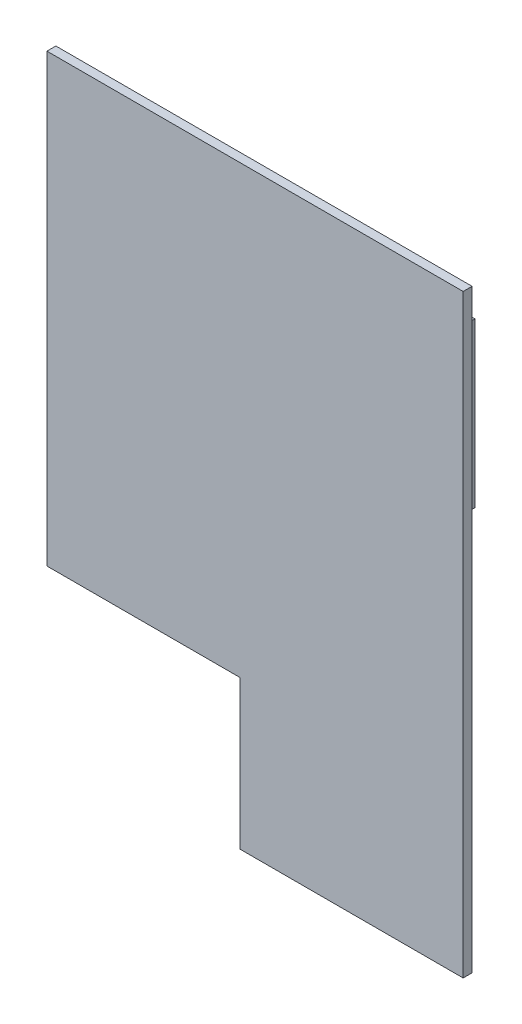
ISO-10303-21;
HEADER;
FILE_DESCRIPTION(('STEP AP214'),'2;1');
FILE_NAME('part.step','',(''),(''),'','','');
FILE_SCHEMA(('AUTOMOTIVE_DESIGN { 1 0 10303 214 1 1 1 1 }'));
ENDSEC;
DATA;
#1=APPLICATION_CONTEXT('core data for automotive mechanical design processes');
#2=APPLICATION_PROTOCOL_DEFINITION('international standard','automotive_design',2000,#1);
#3=PRODUCT_CONTEXT('',#1,'mechanical');
#4=PRODUCT('Part','Part','',(#3));
#5=PRODUCT_RELATED_PRODUCT_CATEGORY('part','',(#4));
#6=PRODUCT_DEFINITION_FORMATION('','',#4);
#7=PRODUCT_DEFINITION_CONTEXT('part definition',#1,'design');
#8=PRODUCT_DEFINITION('design','',#6,#7);
#9=PRODUCT_DEFINITION_SHAPE('','',#8);
#10=(LENGTH_UNIT() NAMED_UNIT(*) SI_UNIT(.MILLI.,.METRE.));
#11=(NAMED_UNIT(*) PLANE_ANGLE_UNIT() SI_UNIT($,.RADIAN.));
#12=(NAMED_UNIT(*) SI_UNIT($,.STERADIAN.) SOLID_ANGLE_UNIT());
#13=UNCERTAINTY_MEASURE_WITH_UNIT(LENGTH_MEASURE(1.E-05),#10,'distance_accuracy_value','');
#14=(GEOMETRIC_REPRESENTATION_CONTEXT(3) GLOBAL_UNCERTAINTY_ASSIGNED_CONTEXT((#13)) GLOBAL_UNIT_ASSIGNED_CONTEXT((#10,
#11,#12)) REPRESENTATION_CONTEXT('',''));
#15=CARTESIAN_POINT('',(0.,0.,0.));
#16=DIRECTION('',(0.,0.,1.));
#17=DIRECTION('',(1.,0.,0.));
#18=AXIS2_PLACEMENT_3D('',#15,#16,#17);
#19=CARTESIAN_POINT('',(0.,0.,-3.));
#20=DIRECTION('',(0.,0.,-1.));
#21=DIRECTION('',(1.,0.,0.));
#22=AXIS2_PLACEMENT_3D('',#19,#20,#21);
#23=PLANE('',#22);
#24=DIRECTION('',(1.,0.,0.));
#25=VECTOR('',#24,1.);
#26=CARTESIAN_POINT('',(0.,-200.,-3.));
#27=LINE('',#26,#25);
#28=CARTESIAN_POINT('',(65.,-200.,-3.));
#29=VERTEX_POINT('',#28);
#30=CARTESIAN_POINT('',(140.,-200.,-3.));
#31=VERTEX_POINT('',#30);
#32=EDGE_CURVE('E246',#29,#31,#27,.T.);
#33=ORIENTED_EDGE('',*,*,#32,.F.);
#34=DIRECTION('',(0.,1.,0.));
#35=VECTOR('',#34,1.);
#36=CARTESIAN_POINT('',(65.,0.,-3.));
#37=LINE('',#36,#35);
#38=CARTESIAN_POINT('',(65.,-150.,-3.));
#39=VERTEX_POINT('',#38);
#40=EDGE_CURVE('E234',#29,#39,#37,.T.);
#41=ORIENTED_EDGE('',*,*,#40,.T.);
#42=DIRECTION('',(-1.,0.,0.));
#43=VECTOR('',#42,1.);
#44=CARTESIAN_POINT('',(0.,-150.,-3.));
#45=LINE('',#44,#43);
#46=CARTESIAN_POINT('',(0.,-150.,-3.));
#47=VERTEX_POINT('',#46);
#48=EDGE_CURVE('E231',#39,#47,#45,.T.);
#49=ORIENTED_EDGE('',*,*,#48,.T.);
#50=DIRECTION('',(0.,-1.,0.));
#51=VECTOR('',#50,1.);
#52=CARTESIAN_POINT('',(0.,0.,-3.));
#53=LINE('',#52,#51);
#54=CARTESIAN_POINT('',(0.,0.,-3.));
#55=VERTEX_POINT('',#54);
#56=EDGE_CURVE('E237',#55,#47,#53,.T.);
#57=ORIENTED_EDGE('',*,*,#56,.F.);
#58=DIRECTION('',(-1.,0.,0.));
#59=VECTOR('',#58,1.);
#60=CARTESIAN_POINT('',(0.,0.,-3.));
#61=LINE('',#60,#59);
#62=CARTESIAN_POINT('',(140.,0.,-3.));
#63=VERTEX_POINT('',#62);
#64=EDGE_CURVE('E240',#63,#55,#61,.T.);
#65=ORIENTED_EDGE('',*,*,#64,.F.);
#66=DIRECTION('',(0.,1.,0.));
#67=VECTOR('',#66,1.);
#68=CARTESIAN_POINT('',(140.,0.,-3.));
#69=LINE('',#68,#67);
#70=EDGE_CURVE('E243',#31,#63,#69,.T.);
#71=ORIENTED_EDGE('',*,*,#70,.F.);
#72=EDGE_LOOP('',(#33,#41,#49,#57,#65,#71));
#73=FACE_BOUND('',#72,.T.);
#74=DIRECTION('',(0.,-1.,0.));
#75=VECTOR('',#74,1.);
#76=CARTESIAN_POINT('',(8.,0.,-3.));
#77=LINE('',#76,#75);
#78=CARTESIAN_POINT('',(8.,-27.,-3.));
#79=VERTEX_POINT('',#78);
#80=CARTESIAN_POINT('',(8.,-82.,-3.));
#81=VERTEX_POINT('',#80);
#82=EDGE_CURVE('E214',#79,#81,#77,.T.);
#83=ORIENTED_EDGE('',*,*,#82,.F.);
#84=DIRECTION('',(1.,0.,0.));
#85=VECTOR('',#84,1.);
#86=CARTESIAN_POINT('',(0.,-27.,-3.));
#87=LINE('',#86,#85);
#88=CARTESIAN_POINT('',(5.,-27.,-3.));
#89=VERTEX_POINT('',#88);
#90=EDGE_CURVE('E190',#89,#79,#87,.T.);
#91=ORIENTED_EDGE('',*,*,#90,.F.);
#92=DIRECTION('',(0.,-1.,0.));
#93=VECTOR('',#92,1.);
#94=CARTESIAN_POINT('',(5.,0.,-3.));
#95=LINE('',#94,#93);
#96=CARTESIAN_POINT('',(5.00000000000001,-82.,-3.));
#97=VERTEX_POINT('',#96);
#98=EDGE_CURVE('E203',#89,#97,#95,.T.);
#99=ORIENTED_EDGE('',*,*,#98,.T.);
#100=DIRECTION('',(1.,0.,0.));
#101=VECTOR('',#100,1.);
#102=CARTESIAN_POINT('',(0.,-82.,-3.));
#103=LINE('',#102,#101);
#104=EDGE_CURVE('E217',#97,#81,#103,.T.);
#105=ORIENTED_EDGE('',*,*,#104,.T.);
#106=EDGE_LOOP('',(#83,#91,#99,#105));
#107=FACE_BOUND('',#106,.T.);
#108=DIRECTION('',(0.,1.,0.));
#109=VECTOR('',#108,1.);
#110=CARTESIAN_POINT('',(120.,-27.,-3.));
#111=LINE('',#110,#109);
#112=CARTESIAN_POINT('',(120.,-82.,-3.));
#113=VERTEX_POINT('',#112);
#114=CARTESIAN_POINT('',(120.,-27.,-3.));
#115=VERTEX_POINT('',#114);
#116=EDGE_CURVE('E172',#113,#115,#111,.T.);
#117=ORIENTED_EDGE('',*,*,#116,.F.);
#118=DIRECTION('',(-1.,0.,0.));
#119=VECTOR('',#118,1.);
#120=CARTESIAN_POINT('',(123.,-82.,-3.));
#121=LINE('',#120,#119);
#122=CARTESIAN_POINT('',(123.,-82.,-3.));
#123=VERTEX_POINT('',#122);
#124=EDGE_CURVE('E166',#123,#113,#121,.T.);
#125=ORIENTED_EDGE('',*,*,#124,.F.);
#126=DIRECTION('',(0.,-1.,0.));
#127=VECTOR('',#126,1.);
#128=CARTESIAN_POINT('',(123.,-27.,-3.));
#129=LINE('',#128,#127);
#130=CARTESIAN_POINT('',(123.,-27.,-3.));
#131=VERTEX_POINT('',#130);
#132=EDGE_CURVE('E147',#131,#123,#129,.T.);
#133=ORIENTED_EDGE('',*,*,#132,.F.);
#134=DIRECTION('',(1.,0.,0.));
#135=VECTOR('',#134,1.);
#136=CARTESIAN_POINT('',(123.,-27.,-3.));
#137=LINE('',#136,#135);
#138=EDGE_CURVE('E56',#115,#131,#137,.T.);
#139=ORIENTED_EDGE('',*,*,#138,.F.);
#140=EDGE_LOOP('',(#117,#125,#133,#139));
#141=FACE_BOUND('',#140,.T.);
#142=ADVANCED_FACE('F39',(#73,#107,#141),#23,.T.);
#143=CARTESIAN_POINT('',(0.,0.,3.));
#144=DIRECTION('',(1.,0.,0.));
#145=DIRECTION('',(0.,1.,0.));
#146=AXIS2_PLACEMENT_3D('',#143,#144,#145);
#147=PLANE('',#146);
#148=DIRECTION('',(0.,0.,-1.));
#149=VECTOR('',#148,1.);
#150=CARTESIAN_POINT('',(0.,-150.,10.));
#151=LINE('',#150,#149);
#152=CARTESIAN_POINT('',(0.,-150.,0.));
#153=VERTEX_POINT('',#152);
#154=EDGE_CURVE('E253',#153,#47,#151,.T.);
#155=ORIENTED_EDGE('',*,*,#154,.F.);
#156=DIRECTION('',(0.,-1.,0.));
#157=VECTOR('',#156,1.);
#158=CARTESIAN_POINT('',(0.,0.,0.));
#159=LINE('',#158,#157);
#160=CARTESIAN_POINT('',(0.,0.,0.));
#161=VERTEX_POINT('',#160);
#162=EDGE_CURVE('E64',#161,#153,#159,.T.);
#163=ORIENTED_EDGE('',*,*,#162,.F.);
#164=DIRECTION('',(0.,0.,-1.));
#165=VECTOR('',#164,1.);
#166=CARTESIAN_POINT('',(0.,0.,3.));
#167=LINE('',#166,#165);
#168=EDGE_CURVE('E252',#161,#55,#167,.T.);
#169=ORIENTED_EDGE('',*,*,#168,.T.);
#170=ORIENTED_EDGE('',*,*,#56,.T.);
#171=EDGE_LOOP('',(#155,#163,#169,#170));
#172=FACE_BOUND('',#171,.T.);
#173=ADVANCED_FACE('F41',(#172),#147,.F.);
#174=CARTESIAN_POINT('',(0.,-200.,3.));
#175=DIRECTION('',(0.,1.,0.));
#176=DIRECTION('',(0.,0.,1.));
#177=AXIS2_PLACEMENT_3D('',#174,#175,#176);
#178=PLANE('',#177);
#179=DIRECTION('',(0.,0.,-1.));
#180=VECTOR('',#179,1.);
#181=CARTESIAN_POINT('',(140.,-200.,3.));
#182=LINE('',#181,#180);
#183=CARTESIAN_POINT('',(140.,-200.,0.));
#184=VERTEX_POINT('',#183);
#185=EDGE_CURVE('E11',#184,#31,#182,.T.);
#186=ORIENTED_EDGE('',*,*,#185,.F.);
#187=DIRECTION('',(1.,0.,0.));
#188=VECTOR('',#187,1.);
#189=CARTESIAN_POINT('',(-0.00100000000002876,-200.,0.));
#190=LINE('',#189,#188);
#191=CARTESIAN_POINT('',(65.,-200.,0.));
#192=VERTEX_POINT('',#191);
#193=EDGE_CURVE('E161',#192,#184,#190,.T.);
#194=ORIENTED_EDGE('',*,*,#193,.F.);
#195=DIRECTION('',(0.,0.,-1.));
#196=VECTOR('',#195,1.);
#197=CARTESIAN_POINT('',(65.,-200.,10.));
#198=LINE('',#197,#196);
#199=EDGE_CURVE('E249',#192,#29,#198,.T.);
#200=ORIENTED_EDGE('',*,*,#199,.T.);
#201=ORIENTED_EDGE('',*,*,#32,.T.);
#202=EDGE_LOOP('',(#186,#194,#200,#201));
#203=FACE_BOUND('',#202,.T.);
#204=ADVANCED_FACE('F300',(#203),#178,.F.);
#205=CARTESIAN_POINT('',(140.,0.,3.));
#206=DIRECTION('',(-1.,0.,0.));
#207=DIRECTION('',(0.,-1.,0.));
#208=AXIS2_PLACEMENT_3D('',#205,#206,#207);
#209=PLANE('',#208);
#210=DIRECTION('',(0.,0.,-1.));
#211=VECTOR('',#210,1.);
#212=CARTESIAN_POINT('',(140.,0.,3.));
#213=LINE('',#212,#211);
#214=CARTESIAN_POINT('',(140.,0.,0.));
#215=VERTEX_POINT('',#214);
#216=EDGE_CURVE('E48',#215,#63,#213,.T.);
#217=ORIENTED_EDGE('',*,*,#216,.F.);
#218=DIRECTION('',(0.,1.,0.));
#219=VECTOR('',#218,1.);
#220=CARTESIAN_POINT('',(140.,0.,0.));
#221=LINE('',#220,#219);
#222=EDGE_CURVE('E177',#184,#215,#221,.T.);
#223=ORIENTED_EDGE('',*,*,#222,.F.);
#224=ORIENTED_EDGE('',*,*,#185,.T.);
#225=ORIENTED_EDGE('',*,*,#70,.T.);
#226=EDGE_LOOP('',(#217,#223,#224,#225));
#227=FACE_BOUND('',#226,.T.);
#228=ADVANCED_FACE('F319',(#227),#209,.F.);
#229=CARTESIAN_POINT('',(0.,0.,3.));
#230=DIRECTION('',(0.,-1.,0.));
#231=DIRECTION('',(0.,0.,-1.));
#232=AXIS2_PLACEMENT_3D('',#229,#230,#231);
#233=PLANE('',#232);
#234=ORIENTED_EDGE('',*,*,#168,.F.);
#235=DIRECTION('',(1.,0.,0.));
#236=VECTOR('',#235,1.);
#237=CARTESIAN_POINT('',(-0.00100000000002876,0.,0.));
#238=LINE('',#237,#236);
#239=EDGE_CURVE('E179',#161,#215,#238,.T.);
#240=ORIENTED_EDGE('',*,*,#239,.T.);
#241=ORIENTED_EDGE('',*,*,#216,.T.);
#242=ORIENTED_EDGE('',*,*,#64,.T.);
#243=EDGE_LOOP('',(#234,#240,#241,#242));
#244=FACE_BOUND('',#243,.T.);
#245=ADVANCED_FACE('F315',(#244),#233,.F.);
#246=CARTESIAN_POINT('',(65.,-200.,10.));
#247=DIRECTION('',(1.,0.,0.));
#248=DIRECTION('',(0.,0.,-1.));
#249=AXIS2_PLACEMENT_3D('',#246,#247,#248);
#250=PLANE('',#249);
#251=ORIENTED_EDGE('',*,*,#199,.F.);
#252=DIRECTION('',(0.,-1.,0.));
#253=VECTOR('',#252,1.);
#254=CARTESIAN_POINT('',(65.,0.,0.));
#255=LINE('',#254,#253);
#256=CARTESIAN_POINT('',(65.,-150.,0.));
#257=VERTEX_POINT('',#256);
#258=EDGE_CURVE('E184',#257,#192,#255,.T.);
#259=ORIENTED_EDGE('',*,*,#258,.F.);
#260=DIRECTION('',(0.,0.,-1.));
#261=VECTOR('',#260,1.);
#262=CARTESIAN_POINT('',(65.,-150.,10.));
#263=LINE('',#262,#261);
#264=EDGE_CURVE('E250',#257,#39,#263,.T.);
#265=ORIENTED_EDGE('',*,*,#264,.T.);
#266=ORIENTED_EDGE('',*,*,#40,.F.);
#267=EDGE_LOOP('',(#251,#259,#265,#266));
#268=FACE_BOUND('',#267,.T.);
#269=ADVANCED_FACE('F311',(#268),#250,.F.);
#270=CARTESIAN_POINT('',(65.,-150.,10.));
#271=DIRECTION('',(0.,1.,0.));
#272=DIRECTION('',(0.,0.,1.));
#273=AXIS2_PLACEMENT_3D('',#270,#271,#272);
#274=PLANE('',#273);
#275=ORIENTED_EDGE('',*,*,#264,.F.);
#276=DIRECTION('',(1.,0.,0.));
#277=VECTOR('',#276,1.);
#278=CARTESIAN_POINT('',(-0.00100000000002876,-150.,0.));
#279=LINE('',#278,#277);
#280=EDGE_CURVE('E182',#153,#257,#279,.T.);
#281=ORIENTED_EDGE('',*,*,#280,.F.);
#282=ORIENTED_EDGE('',*,*,#154,.T.);
#283=ORIENTED_EDGE('',*,*,#48,.F.);
#284=EDGE_LOOP('',(#275,#281,#282,#283));
#285=FACE_BOUND('',#284,.T.);
#286=ADVANCED_FACE('F308',(#285),#274,.F.);
#287=CARTESIAN_POINT('',(0.,-27.,-21.));
#288=DIRECTION('',(0.,-1.,0.));
#289=DIRECTION('',(0.,0.,-1.));
#290=AXIS2_PLACEMENT_3D('',#287,#288,#289);
#291=PLANE('',#290);
#292=ORIENTED_EDGE('',*,*,#90,.T.);
#293=DIRECTION('',(0.,0.,1.));
#294=VECTOR('',#293,1.);
#295=CARTESIAN_POINT('',(8.,-27.,-21.));
#296=LINE('',#295,#294);
#297=CARTESIAN_POINT('',(8.,-27.,-21.));
#298=VERTEX_POINT('',#297);
#299=EDGE_CURVE('E228',#298,#79,#296,.T.);
#300=ORIENTED_EDGE('',*,*,#299,.F.);
#301=DIRECTION('',(1.,0.,0.));
#302=VECTOR('',#301,1.);
#303=CARTESIAN_POINT('',(0.,-27.,-21.));
#304=LINE('',#303,#302);
#305=CARTESIAN_POINT('',(5.,-27.,-21.));
#306=VERTEX_POINT('',#305);
#307=EDGE_CURVE('E199',#306,#298,#304,.T.);
#308=ORIENTED_EDGE('',*,*,#307,.F.);
#309=DIRECTION('',(0.,0.,1.));
#310=VECTOR('',#309,1.);
#311=CARTESIAN_POINT('',(5.,-27.,-21.));
#312=LINE('',#311,#310);
#313=EDGE_CURVE('E211',#306,#89,#312,.T.);
#314=ORIENTED_EDGE('',*,*,#313,.T.);
#315=EDGE_LOOP('',(#292,#300,#308,#314));
#316=FACE_BOUND('',#315,.T.);
#317=ADVANCED_FACE('F306',(#316),#291,.F.);
#318=CARTESIAN_POINT('',(8.,0.,-21.));
#319=DIRECTION('',(-1.,0.,0.));
#320=DIRECTION('',(0.,0.,1.));
#321=AXIS2_PLACEMENT_3D('',#318,#319,#320);
#322=PLANE('',#321);
#323=CARTESIAN_POINT('',(8.00000000000001,-76.1644741197591,-13.0000000000001));
#324=DIRECTION('',(-1.,0.,0.));
#325=DIRECTION('',(0.,0.,1.));
#326=AXIS2_PLACEMENT_3D('',#323,#324,#325);
#327=CIRCLE('',#326,1.5);
#328=CARTESIAN_POINT('',(8.00000000000001,-76.1644741197591,-11.5000000000001));
#329=VERTEX_POINT('',#328);
#330=EDGE_CURVE('E191',#329,#329,#327,.T.);
#331=ORIENTED_EDGE('',*,*,#330,.T.);
#332=EDGE_LOOP('',(#331));
#333=FACE_BOUND('',#332,.T.);
#334=CARTESIAN_POINT('',(8.00000000000001,-36.1644741197591,-13.0000000000001));
#335=DIRECTION('',(-1.,0.,0.));
#336=DIRECTION('',(0.,0.,1.));
#337=AXIS2_PLACEMENT_3D('',#334,#335,#336);
#338=CIRCLE('',#337,1.5);
#339=CARTESIAN_POINT('',(8.00000000000001,-36.1644741197591,-11.5000000000001));
#340=VERTEX_POINT('',#339);
#341=EDGE_CURVE('E186',#340,#340,#338,.T.);
#342=ORIENTED_EDGE('',*,*,#341,.T.);
#343=EDGE_LOOP('',(#342));
#344=FACE_BOUND('',#343,.T.);
#345=ORIENTED_EDGE('',*,*,#82,.T.);
#346=DIRECTION('',(0.,0.,1.));
#347=VECTOR('',#346,1.);
#348=CARTESIAN_POINT('',(8.,-82.,-21.));
#349=LINE('',#348,#347);
#350=CARTESIAN_POINT('',(8.,-82.,-21.));
#351=VERTEX_POINT('',#350);
#352=EDGE_CURVE('E225',#351,#81,#349,.T.);
#353=ORIENTED_EDGE('',*,*,#352,.F.);
#354=DIRECTION('',(0.,-1.,0.));
#355=VECTOR('',#354,1.);
#356=CARTESIAN_POINT('',(8.,0.,-21.));
#357=LINE('',#356,#355);
#358=EDGE_CURVE('E202',#298,#351,#357,.T.);
#359=ORIENTED_EDGE('',*,*,#358,.F.);
#360=ORIENTED_EDGE('',*,*,#299,.T.);
#361=EDGE_LOOP('',(#345,#353,#359,#360));
#362=FACE_BOUND('',#361,.T.);
#363=ADVANCED_FACE('F366',(#333,#344,#362),#322,.F.);
#364=CARTESIAN_POINT('',(0.,-82.,-21.));
#365=DIRECTION('',(0.,-1.,0.));
#366=DIRECTION('',(0.,0.,-1.));
#367=AXIS2_PLACEMENT_3D('',#364,#365,#366);
#368=PLANE('',#367);
#369=ORIENTED_EDGE('',*,*,#104,.F.);
#370=DIRECTION('',(0.,0.,1.));
#371=VECTOR('',#370,1.);
#372=CARTESIAN_POINT('',(5.00000000000001,-82.,-21.));
#373=LINE('',#372,#371);
#374=CARTESIAN_POINT('',(5.00000000000001,-82.,-21.));
#375=VERTEX_POINT('',#374);
#376=EDGE_CURVE('E222',#375,#97,#373,.T.);
#377=ORIENTED_EDGE('',*,*,#376,.F.);
#378=DIRECTION('',(1.,0.,0.));
#379=VECTOR('',#378,1.);
#380=CARTESIAN_POINT('',(0.,-82.,-21.));
#381=LINE('',#380,#379);
#382=EDGE_CURVE('E205',#375,#351,#381,.T.);
#383=ORIENTED_EDGE('',*,*,#382,.T.);
#384=ORIENTED_EDGE('',*,*,#352,.T.);
#385=EDGE_LOOP('',(#369,#377,#383,#384));
#386=FACE_BOUND('',#385,.T.);
#387=ADVANCED_FACE('F373',(#386),#368,.T.);
#388=CARTESIAN_POINT('',(5.,0.,-21.));
#389=DIRECTION('',(-1.,0.,0.));
#390=DIRECTION('',(0.,-1.,0.));
#391=AXIS2_PLACEMENT_3D('',#388,#389,#390);
#392=PLANE('',#391);
#393=CARTESIAN_POINT('',(5.00000000000001,-76.1644741197591,-13.0000000000001));
#394=DIRECTION('',(1.,0.,0.));
#395=DIRECTION('',(0.,-1.,0.));
#396=AXIS2_PLACEMENT_3D('',#393,#394,#395);
#397=CIRCLE('',#396,1.5);
#398=CARTESIAN_POINT('',(5.00000000000001,-77.6644741197591,-13.0000000000001));
#399=VERTEX_POINT('',#398);
#400=EDGE_CURVE('E187',#399,#399,#397,.T.);
#401=ORIENTED_EDGE('',*,*,#400,.T.);
#402=EDGE_LOOP('',(#401));
#403=FACE_BOUND('',#402,.T.);
#404=CARTESIAN_POINT('',(5.,-36.1644741197591,-13.0000000000001));
#405=DIRECTION('',(1.,0.,0.));
#406=DIRECTION('',(0.,-1.,0.));
#407=AXIS2_PLACEMENT_3D('',#404,#405,#406);
#408=CIRCLE('',#407,1.5);
#409=CARTESIAN_POINT('',(5.,-37.6644741197591,-13.0000000000001));
#410=VERTEX_POINT('',#409);
#411=EDGE_CURVE('E194',#410,#410,#408,.T.);
#412=ORIENTED_EDGE('',*,*,#411,.T.);
#413=EDGE_LOOP('',(#412));
#414=FACE_BOUND('',#413,.T.);
#415=ORIENTED_EDGE('',*,*,#98,.F.);
#416=ORIENTED_EDGE('',*,*,#313,.F.);
#417=DIRECTION('',(0.,-1.,0.));
#418=VECTOR('',#417,1.);
#419=CARTESIAN_POINT('',(5.,0.,-21.));
#420=LINE('',#419,#418);
#421=EDGE_CURVE('E208',#306,#375,#420,.T.);
#422=ORIENTED_EDGE('',*,*,#421,.T.);
#423=ORIENTED_EDGE('',*,*,#376,.T.);
#424=EDGE_LOOP('',(#415,#416,#422,#423));
#425=FACE_BOUND('',#424,.T.);
#426=ADVANCED_FACE('F380',(#403,#414,#425),#392,.T.);
#427=CARTESIAN_POINT('',(0.,0.,-21.));
#428=DIRECTION('',(0.,0.,-1.));
#429=DIRECTION('',(1.,0.,0.));
#430=AXIS2_PLACEMENT_3D('',#427,#428,#429);
#431=PLANE('',#430);
#432=ORIENTED_EDGE('',*,*,#307,.T.);
#433=ORIENTED_EDGE('',*,*,#358,.T.);
#434=ORIENTED_EDGE('',*,*,#382,.F.);
#435=ORIENTED_EDGE('',*,*,#421,.F.);
#436=EDGE_LOOP('',(#432,#433,#434,#435));
#437=FACE_BOUND('',#436,.T.);
#438=ADVANCED_FACE('F388',(#437),#431,.T.);
#439=CARTESIAN_POINT('',(140.001,-36.164474119759,-13.0000000000001));
#440=DIRECTION('',(-1.,0.,0.));
#441=DIRECTION('',(0.,-1.,0.));
#442=AXIS2_PLACEMENT_3D('',#439,#440,#441);
#443=CYLINDRICAL_SURFACE('',#442,1.5);
#444=ORIENTED_EDGE('',*,*,#411,.F.);
#445=EDGE_LOOP('',(#444));
#446=FACE_BOUND('',#445,.T.);
#447=ORIENTED_EDGE('',*,*,#341,.F.);
#448=EDGE_LOOP('',(#447));
#449=FACE_BOUND('',#448,.T.);
#450=ADVANCED_FACE('F396',(#446,#449),#443,.F.);
#451=CARTESIAN_POINT('',(140.001,-76.164474119759,-13.0000000000001));
#452=DIRECTION('',(-1.,0.,0.));
#453=DIRECTION('',(0.,-1.,0.));
#454=AXIS2_PLACEMENT_3D('',#451,#452,#453);
#455=CYLINDRICAL_SURFACE('',#454,1.5);
#456=ORIENTED_EDGE('',*,*,#400,.F.);
#457=EDGE_LOOP('',(#456));
#458=FACE_BOUND('',#457,.T.);
#459=ORIENTED_EDGE('',*,*,#330,.F.);
#460=EDGE_LOOP('',(#459));
#461=FACE_BOUND('',#460,.T.);
#462=ADVANCED_FACE('F292',(#458,#461),#455,.F.);
#463=CARTESIAN_POINT('',(-0.00100000000002876,0.,0.));
#464=DIRECTION('',(0.,0.,-1.));
#465=DIRECTION('',(-1.,0.,0.));
#466=AXIS2_PLACEMENT_3D('',#463,#464,#465);
#467=PLANE('',#466);
#468=ORIENTED_EDGE('',*,*,#162,.T.);
#469=ORIENTED_EDGE('',*,*,#280,.T.);
#470=ORIENTED_EDGE('',*,*,#258,.T.);
#471=ORIENTED_EDGE('',*,*,#193,.T.);
#472=ORIENTED_EDGE('',*,*,#222,.T.);
#473=ORIENTED_EDGE('',*,*,#239,.F.);
#474=EDGE_LOOP('',(#468,#469,#470,#471,#472,#473));
#475=FACE_BOUND('',#474,.T.);
#476=ADVANCED_FACE('F283',(#475),#467,.F.);
#477=CARTESIAN_POINT('',(123.,-82.,-76.0817574156817));
#478=DIRECTION('',(0.,1.,0.));
#479=DIRECTION('',(0.,0.,1.));
#480=AXIS2_PLACEMENT_3D('',#477,#478,#479);
#481=PLANE('',#480);
#482=DIRECTION('',(-1.,0.,0.));
#483=VECTOR('',#482,1.);
#484=CARTESIAN_POINT('',(123.,-82.,-21.));
#485=LINE('',#484,#483);
#486=CARTESIAN_POINT('',(123.,-82.,-21.));
#487=VERTEX_POINT('',#486);
#488=CARTESIAN_POINT('',(120.,-82.,-21.));
#489=VERTEX_POINT('',#488);
#490=EDGE_CURVE('E156',#487,#489,#485,.T.);
#491=ORIENTED_EDGE('',*,*,#490,.F.);
#492=DIRECTION('',(0.,0.,1.));
#493=VECTOR('',#492,1.);
#494=CARTESIAN_POINT('',(123.,-82.,-76.0817574156817));
#495=LINE('',#494,#493);
#496=EDGE_CURVE('E152',#487,#123,#495,.T.);
#497=ORIENTED_EDGE('',*,*,#496,.T.);
#498=ORIENTED_EDGE('',*,*,#124,.T.);
#499=DIRECTION('',(0.,0.,1.));
#500=VECTOR('',#499,1.);
#501=CARTESIAN_POINT('',(120.,-82.,-76.0817574156817));
#502=LINE('',#501,#500);
#503=EDGE_CURVE('E170',#489,#113,#502,.T.);
#504=ORIENTED_EDGE('',*,*,#503,.F.);
#505=EDGE_LOOP('',(#491,#497,#498,#504));
#506=FACE_BOUND('',#505,.T.);
#507=ADVANCED_FACE('F281',(#506),#481,.F.);
#508=CARTESIAN_POINT('',(120.,-27.,-76.0817574156817));
#509=DIRECTION('',(1.,0.,0.));
#510=DIRECTION('',(0.,1.,0.));
#511=AXIS2_PLACEMENT_3D('',#508,#509,#510);
#512=PLANE('',#511);
#513=CARTESIAN_POINT('',(120.,-36.1644741197591,-13.0000000000001));
#514=DIRECTION('',(-1.,0.,0.));
#515=DIRECTION('',(0.,-1.,0.));
#516=AXIS2_PLACEMENT_3D('',#513,#514,#515);
#517=CIRCLE('',#516,1.5);
#518=CARTESIAN_POINT('',(120.,-37.6644741197591,-13.0000000000001));
#519=VERTEX_POINT('',#518);
#520=EDGE_CURVE('E259',#519,#519,#517,.T.);
#521=ORIENTED_EDGE('',*,*,#520,.F.);
#522=EDGE_LOOP('',(#521));
#523=FACE_BOUND('',#522,.T.);
#524=CARTESIAN_POINT('',(120.,-76.1644741197591,-13.0000000000001));
#525=DIRECTION('',(-1.,0.,0.));
#526=DIRECTION('',(0.,-1.,0.));
#527=AXIS2_PLACEMENT_3D('',#524,#525,#526);
#528=CIRCLE('',#527,1.5);
#529=CARTESIAN_POINT('',(120.,-77.6644741197591,-13.0000000000001));
#530=VERTEX_POINT('',#529);
#531=EDGE_CURVE('E264',#530,#530,#528,.T.);
#532=ORIENTED_EDGE('',*,*,#531,.F.);
#533=EDGE_LOOP('',(#532));
#534=FACE_BOUND('',#533,.T.);
#535=DIRECTION('',(0.,1.,0.));
#536=VECTOR('',#535,1.);
#537=CARTESIAN_POINT('',(120.,-27.,-21.));
#538=LINE('',#537,#536);
#539=CARTESIAN_POINT('',(120.,-27.,-21.));
#540=VERTEX_POINT('',#539);
#541=EDGE_CURVE('E160',#489,#540,#538,.T.);
#542=ORIENTED_EDGE('',*,*,#541,.F.);
#543=ORIENTED_EDGE('',*,*,#503,.T.);
#544=ORIENTED_EDGE('',*,*,#116,.T.);
#545=DIRECTION('',(0.,0.,1.));
#546=VECTOR('',#545,1.);
#547=CARTESIAN_POINT('',(120.,-27.,-76.0817574156817));
#548=LINE('',#547,#546);
#549=EDGE_CURVE('E173',#540,#115,#548,.T.);
#550=ORIENTED_EDGE('',*,*,#549,.F.);
#551=EDGE_LOOP('',(#542,#543,#544,#550));
#552=FACE_BOUND('',#551,.T.);
#553=ADVANCED_FACE('F275',(#523,#534,#552),#512,.F.);
#554=CARTESIAN_POINT('',(123.,-27.,-76.0817574156817));
#555=DIRECTION('',(0.,-1.,0.));
#556=DIRECTION('',(0.,0.,-1.));
#557=AXIS2_PLACEMENT_3D('',#554,#555,#556);
#558=PLANE('',#557);
#559=DIRECTION('',(1.,0.,0.));
#560=VECTOR('',#559,1.);
#561=CARTESIAN_POINT('',(123.,-27.,-21.));
#562=LINE('',#561,#560);
#563=CARTESIAN_POINT('',(123.,-27.,-21.));
#564=VERTEX_POINT('',#563);
#565=EDGE_CURVE('E142',#540,#564,#562,.T.);
#566=ORIENTED_EDGE('',*,*,#565,.F.);
#567=ORIENTED_EDGE('',*,*,#549,.T.);
#568=ORIENTED_EDGE('',*,*,#138,.T.);
#569=DIRECTION('',(0.,0.,1.));
#570=VECTOR('',#569,1.);
#571=CARTESIAN_POINT('',(123.,-27.,-76.0817574156817));
#572=LINE('',#571,#570);
#573=EDGE_CURVE('E138',#564,#131,#572,.T.);
#574=ORIENTED_EDGE('',*,*,#573,.F.);
#575=EDGE_LOOP('',(#566,#567,#568,#574));
#576=FACE_BOUND('',#575,.T.);
#577=ADVANCED_FACE('F140',(#576),#558,.F.);
#578=CARTESIAN_POINT('',(123.,-27.,-76.0817574156817));
#579=DIRECTION('',(-1.,0.,0.));
#580=DIRECTION('',(0.,0.,1.));
#581=AXIS2_PLACEMENT_3D('',#578,#579,#580);
#582=PLANE('',#581);
#583=CARTESIAN_POINT('',(123.,-36.1644741197591,-13.0000000000001));
#584=DIRECTION('',(-1.,0.,0.));
#585=DIRECTION('',(0.,0.,1.));
#586=AXIS2_PLACEMENT_3D('',#583,#584,#585);
#587=CIRCLE('',#586,1.5);
#588=CARTESIAN_POINT('',(123.,-36.1644741197591,-11.5000000000001));
#589=VERTEX_POINT('',#588);
#590=EDGE_CURVE('E43',#589,#589,#587,.T.);
#591=ORIENTED_EDGE('',*,*,#590,.T.);
#592=EDGE_LOOP('',(#591));
#593=FACE_BOUND('',#592,.T.);
#594=CARTESIAN_POINT('',(123.,-76.1644741197591,-13.0000000000001));
#595=DIRECTION('',(-1.,0.,0.));
#596=DIRECTION('',(0.,0.,1.));
#597=AXIS2_PLACEMENT_3D('',#594,#595,#596);
#598=CIRCLE('',#597,1.5);
#599=CARTESIAN_POINT('',(123.,-76.1644741197591,-11.5000000000001));
#600=VERTEX_POINT('',#599);
#601=EDGE_CURVE('E257',#600,#600,#598,.T.);
#602=ORIENTED_EDGE('',*,*,#601,.T.);
#603=EDGE_LOOP('',(#602));
#604=FACE_BOUND('',#603,.T.);
#605=DIRECTION('',(0.,-1.,0.));
#606=VECTOR('',#605,1.);
#607=CARTESIAN_POINT('',(123.,-27.,-21.));
#608=LINE('',#607,#606);
#609=EDGE_CURVE('E150',#564,#487,#608,.T.);
#610=ORIENTED_EDGE('',*,*,#609,.F.);
#611=ORIENTED_EDGE('',*,*,#573,.T.);
#612=ORIENTED_EDGE('',*,*,#132,.T.);
#613=ORIENTED_EDGE('',*,*,#496,.F.);
#614=EDGE_LOOP('',(#610,#611,#612,#613));
#615=FACE_BOUND('',#614,.T.);
#616=ADVANCED_FACE('F151',(#593,#604,#615),#582,.F.);
#617=CARTESIAN_POINT('',(0.,0.,-21.));
#618=DIRECTION('',(0.,0.,-1.));
#619=DIRECTION('',(1.,0.,0.));
#620=AXIS2_PLACEMENT_3D('',#617,#618,#619);
#621=PLANE('',#620);
#622=ORIENTED_EDGE('',*,*,#609,.T.);
#623=ORIENTED_EDGE('',*,*,#490,.T.);
#624=ORIENTED_EDGE('',*,*,#541,.T.);
#625=ORIENTED_EDGE('',*,*,#565,.T.);
#626=EDGE_LOOP('',(#622,#623,#624,#625));
#627=FACE_BOUND('',#626,.T.);
#628=ADVANCED_FACE('F159',(#627),#621,.T.);
#629=CARTESIAN_POINT('',(130.,-76.1644741197591,-13.0000000000001));
#630=DIRECTION('',(-1.,0.,0.));
#631=DIRECTION('',(0.,-1.,0.));
#632=AXIS2_PLACEMENT_3D('',#629,#630,#631);
#633=CYLINDRICAL_SURFACE('',#632,1.5);
#634=ORIENTED_EDGE('',*,*,#531,.T.);
#635=EDGE_LOOP('',(#634));
#636=FACE_BOUND('',#635,.T.);
#637=ORIENTED_EDGE('',*,*,#601,.F.);
#638=EDGE_LOOP('',(#637));
#639=FACE_BOUND('',#638,.T.);
#640=ADVANCED_FACE('F443',(#636,#639),#633,.F.);
#641=CARTESIAN_POINT('',(130.,-36.1644741197591,-13.0000000000001));
#642=DIRECTION('',(-1.,0.,0.));
#643=DIRECTION('',(0.,-1.,0.));
#644=AXIS2_PLACEMENT_3D('',#641,#642,#643);
#645=CYLINDRICAL_SURFACE('',#644,1.5);
#646=ORIENTED_EDGE('',*,*,#520,.T.);
#647=EDGE_LOOP('',(#646));
#648=FACE_BOUND('',#647,.T.);
#649=ORIENTED_EDGE('',*,*,#590,.F.);
#650=EDGE_LOOP('',(#649));
#651=FACE_BOUND('',#650,.T.);
#652=ADVANCED_FACE('F466',(#648,#651),#645,.F.);
#653=CLOSED_SHELL('',(#142,#173,#204,#228,#245,#269,#286,#317,#363,#387,#426,#438,#450,#462,
#476,#507,#553,#577,#616,#628,#640,#652));
#654=MANIFOLD_SOLID_BREP('B2',#653);
#655=ADVANCED_BREP_SHAPE_REPRESENTATION('',(#18,#654),#14);
#656=SHAPE_DEFINITION_REPRESENTATION(#9,#655);
ENDSEC;
END-ISO-10303-21;
